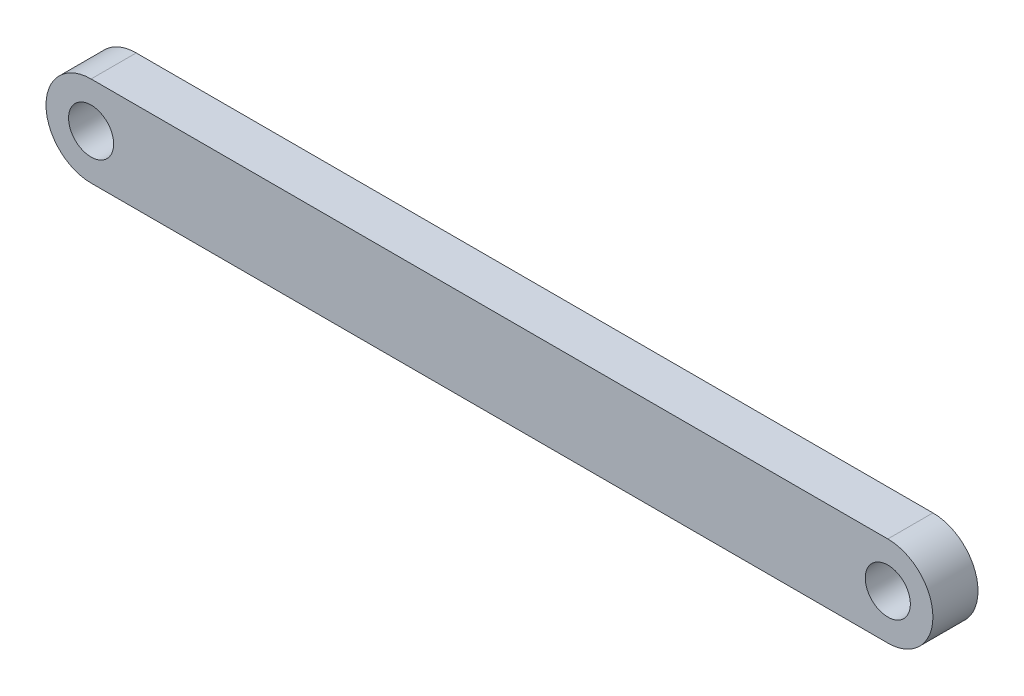
ISO-10303-21;
HEADER;
FILE_DESCRIPTION(('STEP AP214'),'2;1');
FILE_NAME('part.step','',(''),(''),'','','');
FILE_SCHEMA(('AUTOMOTIVE_DESIGN { 1 0 10303 214 1 1 1 1 }'));
ENDSEC;
DATA;
#1=APPLICATION_CONTEXT('core data for automotive mechanical design processes');
#2=APPLICATION_PROTOCOL_DEFINITION('international standard','automotive_design',2000,#1);
#3=PRODUCT_CONTEXT('',#1,'mechanical');
#4=PRODUCT('Part','Part','',(#3));
#5=PRODUCT_RELATED_PRODUCT_CATEGORY('part','',(#4));
#6=PRODUCT_DEFINITION_FORMATION('','',#4);
#7=PRODUCT_DEFINITION_CONTEXT('part definition',#1,'design');
#8=PRODUCT_DEFINITION('design','',#6,#7);
#9=PRODUCT_DEFINITION_SHAPE('','',#8);
#10=(LENGTH_UNIT() NAMED_UNIT(*) SI_UNIT(.MILLI.,.METRE.));
#11=(NAMED_UNIT(*) PLANE_ANGLE_UNIT() SI_UNIT($,.RADIAN.));
#12=(NAMED_UNIT(*) SI_UNIT($,.STERADIAN.) SOLID_ANGLE_UNIT());
#13=UNCERTAINTY_MEASURE_WITH_UNIT(LENGTH_MEASURE(1.E-05),#10,'distance_accuracy_value','');
#14=(GEOMETRIC_REPRESENTATION_CONTEXT(3) GLOBAL_UNCERTAINTY_ASSIGNED_CONTEXT((#13)) GLOBAL_UNIT_ASSIGNED_CONTEXT((#10,
#11,#12)) REPRESENTATION_CONTEXT('',''));
#15=CARTESIAN_POINT('',(0.,0.,0.));
#16=DIRECTION('',(0.,0.,1.));
#17=DIRECTION('',(1.,0.,0.));
#18=AXIS2_PLACEMENT_3D('',#15,#16,#17);
#19=CARTESIAN_POINT('',(0.,0.,3.));
#20=DIRECTION('',(0.,0.,1.));
#21=DIRECTION('',(1.,0.,0.));
#22=AXIS2_PLACEMENT_3D('',#19,#20,#21);
#23=PLANE('',#22);
#24=CARTESIAN_POINT('',(-53.,0.,3.));
#25=DIRECTION('',(0.,0.,1.));
#26=DIRECTION('',(1.,0.,0.));
#27=AXIS2_PLACEMENT_3D('',#24,#25,#26);
#28=CIRCLE('',#27,1.5);
#29=CARTESIAN_POINT('',(-51.5,0.,3.));
#30=VERTEX_POINT('',#29);
#31=EDGE_CURVE('E112',#30,#30,#28,.T.);
#32=ORIENTED_EDGE('',*,*,#31,.F.);
#33=EDGE_LOOP('',(#32));
#34=FACE_BOUND('',#33,.T.);
#35=CARTESIAN_POINT('',(0.,0.,3.));
#36=DIRECTION('',(0.,0.,1.));
#37=DIRECTION('',(1.,0.,0.));
#38=AXIS2_PLACEMENT_3D('',#35,#36,#37);
#39=CIRCLE('',#38,3.);
#40=CARTESIAN_POINT('',(0.,-3.,3.));
#41=VERTEX_POINT('',#40);
#42=CARTESIAN_POINT('',(0.,3.,3.));
#43=VERTEX_POINT('',#42);
#44=EDGE_CURVE('E92',#41,#43,#39,.T.);
#45=ORIENTED_EDGE('',*,*,#44,.T.);
#46=DIRECTION('',(-1.,0.,0.));
#47=VECTOR('',#46,1.);
#48=CARTESIAN_POINT('',(-53.,2.99999999999999,3.));
#49=LINE('',#48,#47);
#50=CARTESIAN_POINT('',(-53.,2.99999999999999,3.));
#51=VERTEX_POINT('',#50);
#52=EDGE_CURVE('E87',#43,#51,#49,.T.);
#53=ORIENTED_EDGE('',*,*,#52,.T.);
#54=CARTESIAN_POINT('',(-53.,0.,3.));
#55=DIRECTION('',(0.,0.,1.));
#56=DIRECTION('',(1.,0.,0.));
#57=AXIS2_PLACEMENT_3D('',#54,#55,#56);
#58=CIRCLE('',#57,3.);
#59=CARTESIAN_POINT('',(-53.,-3.00000000000001,3.));
#60=VERTEX_POINT('',#59);
#61=EDGE_CURVE('E90',#51,#60,#58,.T.);
#62=ORIENTED_EDGE('',*,*,#61,.T.);
#63=DIRECTION('',(1.,0.,0.));
#64=VECTOR('',#63,1.);
#65=CARTESIAN_POINT('',(-53.,-3.00000000000001,3.));
#66=LINE('',#65,#64);
#67=EDGE_CURVE('E57',#60,#41,#66,.T.);
#68=ORIENTED_EDGE('',*,*,#67,.T.);
#69=EDGE_LOOP('',(#45,#53,#62,#68));
#70=FACE_BOUND('',#69,.T.);
#71=CARTESIAN_POINT('',(0.,0.,3.));
#72=DIRECTION('',(0.,0.,1.));
#73=DIRECTION('',(1.,0.,0.));
#74=AXIS2_PLACEMENT_3D('',#71,#72,#73);
#75=CIRCLE('',#74,1.5);
#76=CARTESIAN_POINT('',(1.5,0.,3.));
#77=VERTEX_POINT('',#76);
#78=EDGE_CURVE('E134',#77,#77,#75,.T.);
#79=ORIENTED_EDGE('',*,*,#78,.F.);
#80=EDGE_LOOP('',(#79));
#81=FACE_BOUND('',#80,.T.);
#82=ADVANCED_FACE('F39',(#34,#70,#81),#23,.T.);
#83=CARTESIAN_POINT('',(0.,0.,0.));
#84=DIRECTION('',(0.,0.,1.));
#85=DIRECTION('',(1.,0.,0.));
#86=AXIS2_PLACEMENT_3D('',#83,#84,#85);
#87=PLANE('',#86);
#88=CARTESIAN_POINT('',(0.,0.,0.));
#89=DIRECTION('',(0.,0.,1.));
#90=DIRECTION('',(1.,0.,0.));
#91=AXIS2_PLACEMENT_3D('',#88,#89,#90);
#92=CIRCLE('',#91,3.);
#93=CARTESIAN_POINT('',(0.,-3.,0.));
#94=VERTEX_POINT('',#93);
#95=CARTESIAN_POINT('',(0.,3.,0.));
#96=VERTEX_POINT('',#95);
#97=EDGE_CURVE('E108',#94,#96,#92,.T.);
#98=ORIENTED_EDGE('',*,*,#97,.F.);
#99=DIRECTION('',(1.,0.,0.));
#100=VECTOR('',#99,1.);
#101=CARTESIAN_POINT('',(-53.,-3.00000000000001,0.));
#102=LINE('',#101,#100);
#103=CARTESIAN_POINT('',(-53.,-3.00000000000001,0.));
#104=VERTEX_POINT('',#103);
#105=EDGE_CURVE('E80',#104,#94,#102,.T.);
#106=ORIENTED_EDGE('',*,*,#105,.F.);
#107=CARTESIAN_POINT('',(-53.,0.,0.));
#108=DIRECTION('',(0.,0.,1.));
#109=DIRECTION('',(1.,0.,0.));
#110=AXIS2_PLACEMENT_3D('',#107,#108,#109);
#111=CIRCLE('',#110,3.);
#112=CARTESIAN_POINT('',(-53.,2.99999999999999,0.));
#113=VERTEX_POINT('',#112);
#114=EDGE_CURVE('E74',#113,#104,#111,.T.);
#115=ORIENTED_EDGE('',*,*,#114,.F.);
#116=DIRECTION('',(-1.,0.,0.));
#117=VECTOR('',#116,1.);
#118=CARTESIAN_POINT('',(-53.,2.99999999999999,0.));
#119=LINE('',#118,#117);
#120=EDGE_CURVE('E97',#96,#113,#119,.T.);
#121=ORIENTED_EDGE('',*,*,#120,.F.);
#122=EDGE_LOOP('',(#98,#106,#115,#121));
#123=FACE_BOUND('',#122,.T.);
#124=CARTESIAN_POINT('',(-53.,0.,0.));
#125=DIRECTION('',(0.,0.,1.));
#126=DIRECTION('',(1.,0.,0.));
#127=AXIS2_PLACEMENT_3D('',#124,#125,#126);
#128=CIRCLE('',#127,1.5);
#129=CARTESIAN_POINT('',(-51.5,0.,0.));
#130=VERTEX_POINT('',#129);
#131=EDGE_CURVE('E130',#130,#130,#128,.T.);
#132=ORIENTED_EDGE('',*,*,#131,.T.);
#133=EDGE_LOOP('',(#132));
#134=FACE_BOUND('',#133,.T.);
#135=CARTESIAN_POINT('',(0.,0.,0.));
#136=DIRECTION('',(0.,0.,1.));
#137=DIRECTION('',(1.,0.,0.));
#138=AXIS2_PLACEMENT_3D('',#135,#136,#137);
#139=CIRCLE('',#138,1.5);
#140=CARTESIAN_POINT('',(1.5,0.,0.));
#141=VERTEX_POINT('',#140);
#142=EDGE_CURVE('E138',#141,#141,#139,.T.);
#143=ORIENTED_EDGE('',*,*,#142,.T.);
#144=EDGE_LOOP('',(#143));
#145=FACE_BOUND('',#144,.T.);
#146=ADVANCED_FACE('F125',(#123,#134,#145),#87,.F.);
#147=CARTESIAN_POINT('',(0.,0.,3.));
#148=DIRECTION('',(0.,0.,-1.));
#149=DIRECTION('',(-1.,0.,0.));
#150=AXIS2_PLACEMENT_3D('',#147,#148,#149);
#151=CYLINDRICAL_SURFACE('',#150,3.);
#152=ORIENTED_EDGE('',*,*,#97,.T.);
#153=DIRECTION('',(0.,0.,-1.));
#154=VECTOR('',#153,1.);
#155=CARTESIAN_POINT('',(0.,3.,3.));
#156=LINE('',#155,#154);
#157=EDGE_CURVE('E11',#43,#96,#156,.T.);
#158=ORIENTED_EDGE('',*,*,#157,.F.);
#159=ORIENTED_EDGE('',*,*,#44,.F.);
#160=DIRECTION('',(0.,0.,-1.));
#161=VECTOR('',#160,1.);
#162=CARTESIAN_POINT('',(0.,-3.,3.));
#163=LINE('',#162,#161);
#164=EDGE_CURVE('E104',#41,#94,#163,.T.);
#165=ORIENTED_EDGE('',*,*,#164,.T.);
#166=EDGE_LOOP('',(#152,#158,#159,#165));
#167=FACE_BOUND('',#166,.T.);
#168=ADVANCED_FACE('F41',(#167),#151,.T.);
#169=CARTESIAN_POINT('',(-53.,2.99999999999999,3.));
#170=DIRECTION('',(0.,-1.,0.));
#171=DIRECTION('',(1.,0.,0.));
#172=AXIS2_PLACEMENT_3D('',#169,#170,#171);
#173=PLANE('',#172);
#174=ORIENTED_EDGE('',*,*,#120,.T.);
#175=DIRECTION('',(0.,0.,-1.));
#176=VECTOR('',#175,1.);
#177=CARTESIAN_POINT('',(-53.,2.99999999999999,3.));
#178=LINE('',#177,#176);
#179=EDGE_CURVE('E49',#51,#113,#178,.T.);
#180=ORIENTED_EDGE('',*,*,#179,.F.);
#181=ORIENTED_EDGE('',*,*,#52,.F.);
#182=ORIENTED_EDGE('',*,*,#157,.T.);
#183=EDGE_LOOP('',(#174,#180,#181,#182));
#184=FACE_BOUND('',#183,.T.);
#185=ADVANCED_FACE('F96',(#184),#173,.F.);
#186=CARTESIAN_POINT('',(-53.,0.,3.));
#187=DIRECTION('',(0.,0.,-1.));
#188=DIRECTION('',(-1.,0.,0.));
#189=AXIS2_PLACEMENT_3D('',#186,#187,#188);
#190=CYLINDRICAL_SURFACE('',#189,3.);
#191=ORIENTED_EDGE('',*,*,#114,.T.);
#192=DIRECTION('',(0.,0.,-1.));
#193=VECTOR('',#192,1.);
#194=CARTESIAN_POINT('',(-53.,-3.00000000000001,3.));
#195=LINE('',#194,#193);
#196=EDGE_CURVE('E99',#60,#104,#195,.T.);
#197=ORIENTED_EDGE('',*,*,#196,.F.);
#198=ORIENTED_EDGE('',*,*,#61,.F.);
#199=ORIENTED_EDGE('',*,*,#179,.T.);
#200=EDGE_LOOP('',(#191,#197,#198,#199));
#201=FACE_BOUND('',#200,.T.);
#202=ADVANCED_FACE('F100',(#201),#190,.T.);
#203=CARTESIAN_POINT('',(-53.,-3.00000000000001,3.));
#204=DIRECTION('',(0.,1.,0.));
#205=DIRECTION('',(-1.,0.,0.));
#206=AXIS2_PLACEMENT_3D('',#203,#204,#205);
#207=PLANE('',#206);
#208=ORIENTED_EDGE('',*,*,#105,.T.);
#209=ORIENTED_EDGE('',*,*,#164,.F.);
#210=ORIENTED_EDGE('',*,*,#67,.F.);
#211=ORIENTED_EDGE('',*,*,#196,.T.);
#212=EDGE_LOOP('',(#208,#209,#210,#211));
#213=FACE_BOUND('',#212,.T.);
#214=ADVANCED_FACE('F122',(#213),#207,.F.);
#215=CARTESIAN_POINT('',(-53.,0.,3.));
#216=DIRECTION('',(0.,0.,-1.));
#217=DIRECTION('',(-1.,0.,0.));
#218=AXIS2_PLACEMENT_3D('',#215,#216,#217);
#219=CYLINDRICAL_SURFACE('',#218,1.5);
#220=ORIENTED_EDGE('',*,*,#31,.T.);
#221=EDGE_LOOP('',(#220));
#222=FACE_BOUND('',#221,.T.);
#223=ORIENTED_EDGE('',*,*,#131,.F.);
#224=EDGE_LOOP('',(#223));
#225=FACE_BOUND('',#224,.T.);
#226=ADVANCED_FACE('F157',(#222,#225),#219,.F.);
#227=CARTESIAN_POINT('',(0.,0.,3.));
#228=DIRECTION('',(0.,0.,-1.));
#229=DIRECTION('',(-1.,0.,0.));
#230=AXIS2_PLACEMENT_3D('',#227,#228,#229);
#231=CYLINDRICAL_SURFACE('',#230,1.5);
#232=ORIENTED_EDGE('',*,*,#78,.T.);
#233=EDGE_LOOP('',(#232));
#234=FACE_BOUND('',#233,.T.);
#235=ORIENTED_EDGE('',*,*,#142,.F.);
#236=EDGE_LOOP('',(#235));
#237=FACE_BOUND('',#236,.T.);
#238=ADVANCED_FACE('F146',(#234,#237),#231,.F.);
#239=CLOSED_SHELL('',(#82,#146,#168,#185,#202,#214,#226,#238));
#240=MANIFOLD_SOLID_BREP('B2',#239);
#241=ADVANCED_BREP_SHAPE_REPRESENTATION('',(#18,#240),#14);
#242=SHAPE_DEFINITION_REPRESENTATION(#9,#241);
ENDSEC;
END-ISO-10303-21;
